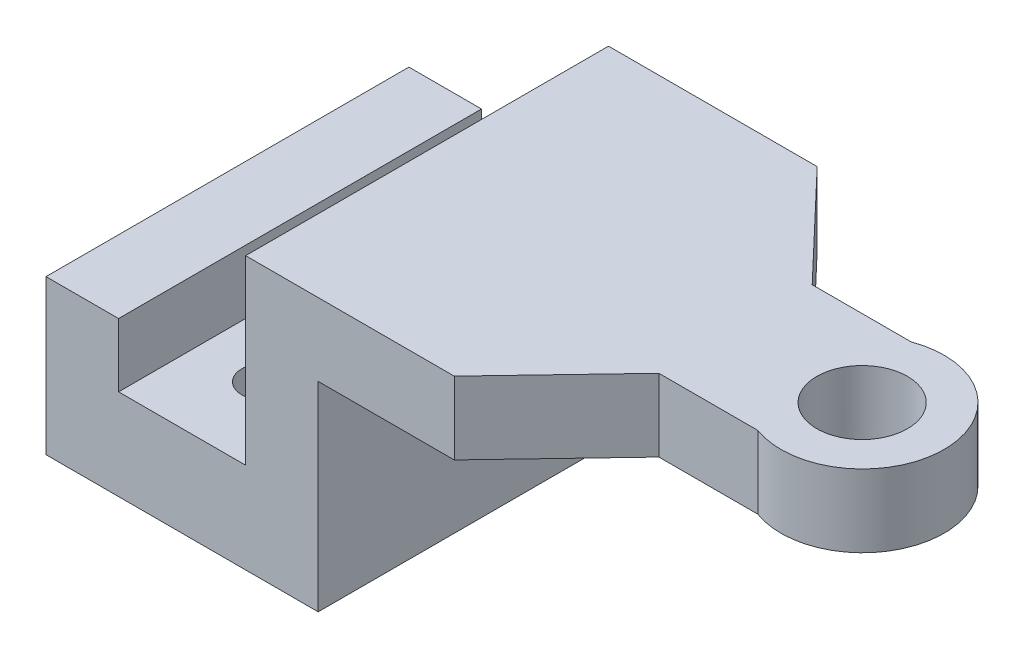
ISO-10303-21;
HEADER;
FILE_DESCRIPTION(('STEP AP214'),'2;1');
FILE_NAME('part.step','',(''),(''),'','','');
FILE_SCHEMA(('AUTOMOTIVE_DESIGN { 1 0 10303 214 1 1 1 1 }'));
ENDSEC;
DATA;
#1=APPLICATION_CONTEXT('core data for automotive mechanical design processes');
#2=APPLICATION_PROTOCOL_DEFINITION('international standard','automotive_design',2000,#1);
#3=PRODUCT_CONTEXT('',#1,'mechanical');
#4=PRODUCT('Part','Part','',(#3));
#5=PRODUCT_RELATED_PRODUCT_CATEGORY('part','',(#4));
#6=PRODUCT_DEFINITION_FORMATION('','',#4);
#7=PRODUCT_DEFINITION_CONTEXT('part definition',#1,'design');
#8=PRODUCT_DEFINITION('design','',#6,#7);
#9=PRODUCT_DEFINITION_SHAPE('','',#8);
#10=(LENGTH_UNIT() NAMED_UNIT(*) SI_UNIT(.MILLI.,.METRE.));
#11=(NAMED_UNIT(*) PLANE_ANGLE_UNIT() SI_UNIT($,.RADIAN.));
#12=(NAMED_UNIT(*) SI_UNIT($,.STERADIAN.) SOLID_ANGLE_UNIT());
#13=UNCERTAINTY_MEASURE_WITH_UNIT(LENGTH_MEASURE(1.E-05),#10,'distance_accuracy_value','');
#14=(GEOMETRIC_REPRESENTATION_CONTEXT(3) GLOBAL_UNCERTAINTY_ASSIGNED_CONTEXT((#13)) GLOBAL_UNIT_ASSIGNED_CONTEXT((#10,
#11,#12)) REPRESENTATION_CONTEXT('',''));
#15=CARTESIAN_POINT('',(0.,0.,0.));
#16=DIRECTION('',(0.,0.,1.));
#17=DIRECTION('',(1.,0.,0.));
#18=AXIS2_PLACEMENT_3D('',#15,#16,#17);
#19=CARTESIAN_POINT('',(0.,150.,0.));
#20=DIRECTION('',(-1.,0.,0.));
#21=DIRECTION('',(0.,0.,1.));
#22=AXIS2_PLACEMENT_3D('',#19,#20,#21);
#23=PLANE('',#22);
#24=DIRECTION('',(0.,-1.,0.));
#25=VECTOR('',#24,1.);
#26=CARTESIAN_POINT('',(0.,150.,0.));
#27=LINE('',#26,#25);
#28=CARTESIAN_POINT('',(0.,85.,0.));
#29=VERTEX_POINT('',#28);
#30=CARTESIAN_POINT('',(0.,0.,0.));
#31=VERTEX_POINT('',#30);
#32=EDGE_CURVE('E11',#29,#31,#27,.T.);
#33=ORIENTED_EDGE('',*,*,#32,.F.);
#34=DIRECTION('',(0.,0.,1.));
#35=VECTOR('',#34,1.);
#36=CARTESIAN_POINT('',(0.,85.,-200.));
#37=LINE('',#36,#35);
#38=CARTESIAN_POINT('',(0.,85.,-200.));
#39=VERTEX_POINT('',#38);
#40=EDGE_CURVE('E219',#39,#29,#37,.T.);
#41=ORIENTED_EDGE('',*,*,#40,.F.);
#42=DIRECTION('',(0.,-1.,0.));
#43=VECTOR('',#42,1.);
#44=CARTESIAN_POINT('',(0.,150.,-200.));
#45=LINE('',#44,#43);
#46=CARTESIAN_POINT('',(0.,0.,-200.));
#47=VERTEX_POINT('',#46);
#48=EDGE_CURVE('E150',#39,#47,#45,.T.);
#49=ORIENTED_EDGE('',*,*,#48,.T.);
#50=DIRECTION('',(0.,0.,-1.));
#51=VECTOR('',#50,1.);
#52=CARTESIAN_POINT('',(0.,0.,0.));
#53=LINE('',#52,#51);
#54=EDGE_CURVE('E151',#31,#47,#53,.T.);
#55=ORIENTED_EDGE('',*,*,#54,.F.);
#56=EDGE_LOOP('',(#33,#41,#49,#55));
#57=FACE_BOUND('',#56,.T.);
#58=ADVANCED_FACE('F47',(#57),#23,.T.);
#59=CARTESIAN_POINT('',(0.,150.,0.));
#60=DIRECTION('',(0.,0.,-1.));
#61=DIRECTION('',(-1.,0.,0.));
#62=AXIS2_PLACEMENT_3D('',#59,#60,#61);
#63=PLANE('',#62);
#64=DIRECTION('',(1.,0.,0.));
#65=VECTOR('',#64,1.);
#66=CARTESIAN_POINT('',(0.,0.,0.));
#67=LINE('',#66,#65);
#68=CARTESIAN_POINT('',(150.,0.,0.));
#69=VERTEX_POINT('',#68);
#70=EDGE_CURVE('E160',#31,#69,#67,.T.);
#71=ORIENTED_EDGE('',*,*,#70,.T.);
#72=DIRECTION('',(0.,-1.,0.));
#73=VECTOR('',#72,1.);
#74=CARTESIAN_POINT('',(150.,110.,0.));
#75=LINE('',#74,#73);
#76=CARTESIAN_POINT('',(150.,110.,0.));
#77=VERTEX_POINT('',#76);
#78=EDGE_CURVE('E64',#77,#69,#75,.T.);
#79=ORIENTED_EDGE('',*,*,#78,.F.);
#80=DIRECTION('',(-1.,0.,0.));
#81=VECTOR('',#80,1.);
#82=CARTESIAN_POINT('',(150.,110.,0.));
#83=LINE('',#82,#81);
#84=CARTESIAN_POINT('',(225.,110.,0.));
#85=VERTEX_POINT('',#84);
#86=EDGE_CURVE('E259',#85,#77,#83,.T.);
#87=ORIENTED_EDGE('',*,*,#86,.F.);
#88=DIRECTION('',(0.,-1.,0.));
#89=VECTOR('',#88,1.);
#90=CARTESIAN_POINT('',(225.,150.,0.));
#91=LINE('',#90,#89);
#92=CARTESIAN_POINT('',(225.,150.,0.));
#93=VERTEX_POINT('',#92);
#94=EDGE_CURVE('E56',#93,#85,#91,.T.);
#95=ORIENTED_EDGE('',*,*,#94,.F.);
#96=DIRECTION('',(1.,0.,0.));
#97=VECTOR('',#96,1.);
#98=CARTESIAN_POINT('',(0.,150.,0.));
#99=LINE('',#98,#97);
#100=CARTESIAN_POINT('',(110.,150.,0.));
#101=VERTEX_POINT('',#100);
#102=EDGE_CURVE('E73',#101,#93,#99,.T.);
#103=ORIENTED_EDGE('',*,*,#102,.F.);
#104=DIRECTION('',(0.,1.,0.));
#105=VECTOR('',#104,1.);
#106=CARTESIAN_POINT('',(110.,50.,0.));
#107=LINE('',#106,#105);
#108=CARTESIAN_POINT('',(110.,50.,0.));
#109=VERTEX_POINT('',#108);
#110=EDGE_CURVE('E303',#109,#101,#107,.T.);
#111=ORIENTED_EDGE('',*,*,#110,.F.);
#112=DIRECTION('',(1.,0.,0.));
#113=VECTOR('',#112,1.);
#114=CARTESIAN_POINT('',(40.,50.,0.));
#115=LINE('',#114,#113);
#116=CARTESIAN_POINT('',(40.,50.,0.));
#117=VERTEX_POINT('',#116);
#118=EDGE_CURVE('E280',#117,#109,#115,.T.);
#119=ORIENTED_EDGE('',*,*,#118,.F.);
#120=DIRECTION('',(0.,1.,0.));
#121=VECTOR('',#120,1.);
#122=CARTESIAN_POINT('',(40.,50.,0.));
#123=LINE('',#122,#121);
#124=CARTESIAN_POINT('',(40.,85.,0.));
#125=VERTEX_POINT('',#124);
#126=EDGE_CURVE('E293',#117,#125,#123,.T.);
#127=ORIENTED_EDGE('',*,*,#126,.T.);
#128=DIRECTION('',(1.,0.,0.));
#129=VECTOR('',#128,1.);
#130=CARTESIAN_POINT('',(0.,85.,0.));
#131=LINE('',#130,#129);
#132=EDGE_CURVE('E313',#29,#125,#131,.T.);
#133=ORIENTED_EDGE('',*,*,#132,.F.);
#134=ORIENTED_EDGE('',*,*,#32,.T.);
#135=EDGE_LOOP('',(#71,#79,#87,#95,#103,#111,#119,#127,#133,#134));
#136=FACE_BOUND('',#135,.T.);
#137=ADVANCED_FACE('F353',(#136),#63,.F.);
#138=CARTESIAN_POINT('',(225.,150.,0.));
#139=DIRECTION('',(-0.724158388191197,0.,-0.689633691761306));
#140=DIRECTION('',(-0.689633691761306,0.,0.724158388191197));
#141=AXIS2_PLACEMENT_3D('',#138,#139,#140);
#142=PLANE('',#141);
#143=ORIENTED_EDGE('',*,*,#94,.T.);
#144=DIRECTION('',(-0.689633691761306,0.,0.724158388191197));
#145=VECTOR('',#144,1.);
#146=CARTESIAN_POINT('',(225.,110.,0.));
#147=LINE('',#146,#145);
#148=CARTESIAN_POINT('',(280.,110.,-57.753430301229));
#149=VERTEX_POINT('',#148);
#150=EDGE_CURVE('E255',#149,#85,#147,.T.);
#151=ORIENTED_EDGE('',*,*,#150,.F.);
#152=DIRECTION('',(0.,-1.,0.));
#153=VECTOR('',#152,1.);
#154=CARTESIAN_POINT('',(280.,150.,-57.753430301229));
#155=LINE('',#154,#153);
#156=CARTESIAN_POINT('',(280.,150.,-57.753430301229));
#157=VERTEX_POINT('',#156);
#158=EDGE_CURVE('E132',#157,#149,#155,.T.);
#159=ORIENTED_EDGE('',*,*,#158,.F.);
#160=DIRECTION('',(0.689633691761306,0.,-0.724158388191197));
#161=VECTOR('',#160,1.);
#162=CARTESIAN_POINT('',(225.,150.,0.));
#163=LINE('',#162,#161);
#164=EDGE_CURVE('E116',#93,#157,#163,.T.);
#165=ORIENTED_EDGE('',*,*,#164,.F.);
#166=EDGE_LOOP('',(#143,#151,#159,#165));
#167=FACE_BOUND('',#166,.T.);
#168=ADVANCED_FACE('F359',(#167),#142,.F.);
#169=CARTESIAN_POINT('',(280.,150.,-57.753430301229));
#170=DIRECTION('',(0.,0.,-1.));
#171=DIRECTION('',(-1.,0.,0.));
#172=AXIS2_PLACEMENT_3D('',#169,#170,#171);
#173=PLANE('',#172);
#174=ORIENTED_EDGE('',*,*,#158,.T.);
#175=DIRECTION('',(-1.,0.,0.));
#176=VECTOR('',#175,1.);
#177=CARTESIAN_POINT('',(280.,110.,-57.753430301229));
#178=LINE('',#177,#176);
#179=CARTESIAN_POINT('',(334.500730704743,110.,-57.7534303012291));
#180=VERTEX_POINT('',#179);
#181=EDGE_CURVE('E128',#180,#149,#178,.T.);
#182=ORIENTED_EDGE('',*,*,#181,.F.);
#183=DIRECTION('',(0.,-1.,0.));
#184=VECTOR('',#183,1.);
#185=CARTESIAN_POINT('',(334.500730704743,150.,-57.7534303012291));
#186=LINE('',#185,#184);
#187=CARTESIAN_POINT('',(334.500730704743,150.,-57.7534303012291));
#188=VERTEX_POINT('',#187);
#189=EDGE_CURVE('E124',#188,#180,#186,.T.);
#190=ORIENTED_EDGE('',*,*,#189,.F.);
#191=DIRECTION('',(1.,0.,0.));
#192=VECTOR('',#191,1.);
#193=CARTESIAN_POINT('',(280.,150.,-57.753430301229));
#194=LINE('',#193,#192);
#195=EDGE_CURVE('E108',#157,#188,#194,.T.);
#196=ORIENTED_EDGE('',*,*,#195,.F.);
#197=EDGE_LOOP('',(#174,#182,#190,#196));
#198=FACE_BOUND('',#197,.T.);
#199=ADVANCED_FACE('F125',(#198),#173,.F.);
#200=CARTESIAN_POINT('',(350.,150.,-100.));
#201=DIRECTION('',(0.,-1.,0.));
#202=DIRECTION('',(0.,0.,-1.));
#203=AXIS2_PLACEMENT_3D('',#200,#201,#202);
#204=CYLINDRICAL_SURFACE('',#203,45.);
#205=CARTESIAN_POINT('',(350.,110.,-100.));
#206=DIRECTION('',(0.,-1.,0.));
#207=DIRECTION('',(0.,0.,1.));
#208=AXIS2_PLACEMENT_3D('',#205,#206,#207);
#209=CIRCLE('',#208,45.);
#210=CARTESIAN_POINT('',(334.500730704743,110.,-142.246569698771));
#211=VERTEX_POINT('',#210);
#212=EDGE_CURVE('E242',#211,#180,#209,.T.);
#213=ORIENTED_EDGE('',*,*,#212,.F.);
#214=DIRECTION('',(0.,-1.,0.));
#215=VECTOR('',#214,1.);
#216=CARTESIAN_POINT('',(334.500730704743,150.,-142.246569698771));
#217=LINE('',#216,#215);
#218=CARTESIAN_POINT('',(334.500730704743,150.,-142.246569698771));
#219=VERTEX_POINT('',#218);
#220=EDGE_CURVE('E133',#219,#211,#217,.T.);
#221=ORIENTED_EDGE('',*,*,#220,.F.);
#222=CARTESIAN_POINT('',(350.,150.,-100.));
#223=DIRECTION('',(0.,-1.,0.));
#224=DIRECTION('',(0.,0.,-1.));
#225=AXIS2_PLACEMENT_3D('',#222,#223,#224);
#226=CIRCLE('',#225,45.);
#227=EDGE_CURVE('E113',#219,#188,#226,.T.);
#228=ORIENTED_EDGE('',*,*,#227,.T.);
#229=ORIENTED_EDGE('',*,*,#189,.T.);
#230=EDGE_LOOP('',(#213,#221,#228,#229));
#231=FACE_BOUND('',#230,.T.);
#232=ADVANCED_FACE('F135',(#231),#204,.T.);
#233=CARTESIAN_POINT('',(280.,150.,-142.246569698771));
#234=DIRECTION('',(0.,0.,-1.));
#235=DIRECTION('',(-1.,0.,0.));
#236=AXIS2_PLACEMENT_3D('',#233,#234,#235);
#237=PLANE('',#236);
#238=DIRECTION('',(1.,0.,0.));
#239=VECTOR('',#238,1.);
#240=CARTESIAN_POINT('',(280.,110.,-142.246569698771));
#241=LINE('',#240,#239);
#242=CARTESIAN_POINT('',(280.,110.,-142.246569698771));
#243=VERTEX_POINT('',#242);
#244=EDGE_CURVE('E235',#243,#211,#241,.T.);
#245=ORIENTED_EDGE('',*,*,#244,.F.);
#246=DIRECTION('',(0.,-1.,0.));
#247=VECTOR('',#246,1.);
#248=CARTESIAN_POINT('',(280.,150.,-142.246569698771));
#249=LINE('',#248,#247);
#250=CARTESIAN_POINT('',(280.,150.,-142.246569698771));
#251=VERTEX_POINT('',#250);
#252=EDGE_CURVE('E170',#251,#243,#249,.T.);
#253=ORIENTED_EDGE('',*,*,#252,.F.);
#254=DIRECTION('',(1.,0.,0.));
#255=VECTOR('',#254,1.);
#256=CARTESIAN_POINT('',(280.,150.,-142.246569698771));
#257=LINE('',#256,#255);
#258=EDGE_CURVE('E138',#251,#219,#257,.T.);
#259=ORIENTED_EDGE('',*,*,#258,.T.);
#260=ORIENTED_EDGE('',*,*,#220,.T.);
#261=EDGE_LOOP('',(#245,#253,#259,#260));
#262=FACE_BOUND('',#261,.T.);
#263=ADVANCED_FACE('F232',(#262),#237,.T.);
#264=CARTESIAN_POINT('',(225.,150.,-200.));
#265=DIRECTION('',(0.724158388191198,0.,-0.689633691761305));
#266=DIRECTION('',(-0.689633691761305,0.,-0.724158388191198));
#267=AXIS2_PLACEMENT_3D('',#264,#265,#266);
#268=PLANE('',#267);
#269=DIRECTION('',(0.689633691761305,0.,0.724158388191198));
#270=VECTOR('',#269,1.);
#271=CARTESIAN_POINT('',(225.,110.,-200.));
#272=LINE('',#271,#270);
#273=CARTESIAN_POINT('',(225.,110.,-200.));
#274=VERTEX_POINT('',#273);
#275=EDGE_CURVE('E243',#274,#243,#272,.T.);
#276=ORIENTED_EDGE('',*,*,#275,.F.);
#277=DIRECTION('',(0.,-1.,0.));
#278=VECTOR('',#277,1.);
#279=CARTESIAN_POINT('',(225.,150.,-200.));
#280=LINE('',#279,#278);
#281=CARTESIAN_POINT('',(225.,150.,-200.));
#282=VERTEX_POINT('',#281);
#283=EDGE_CURVE('E174',#282,#274,#280,.T.);
#284=ORIENTED_EDGE('',*,*,#283,.F.);
#285=DIRECTION('',(0.689633691761305,0.,0.724158388191198));
#286=VECTOR('',#285,1.);
#287=CARTESIAN_POINT('',(225.,150.,-200.));
#288=LINE('',#287,#286);
#289=EDGE_CURVE('E142',#282,#251,#288,.T.);
#290=ORIENTED_EDGE('',*,*,#289,.T.);
#291=ORIENTED_EDGE('',*,*,#252,.T.);
#292=EDGE_LOOP('',(#276,#284,#290,#291));
#293=FACE_BOUND('',#292,.T.);
#294=ADVANCED_FACE('F227',(#293),#268,.T.);
#295=CARTESIAN_POINT('',(0.,150.,-200.));
#296=DIRECTION('',(0.,0.,-1.));
#297=DIRECTION('',(-1.,0.,0.));
#298=AXIS2_PLACEMENT_3D('',#295,#296,#297);
#299=PLANE('',#298);
#300=DIRECTION('',(0.,-1.,0.));
#301=VECTOR('',#300,1.);
#302=CARTESIAN_POINT('',(150.,110.,-200.));
#303=LINE('',#302,#301);
#304=CARTESIAN_POINT('',(150.,110.,-200.));
#305=VERTEX_POINT('',#304);
#306=CARTESIAN_POINT('',(150.,0.,-200.));
#307=VERTEX_POINT('',#306);
#308=EDGE_CURVE('E270',#305,#307,#303,.T.);
#309=ORIENTED_EDGE('',*,*,#308,.T.);
#310=DIRECTION('',(1.,0.,0.));
#311=VECTOR('',#310,1.);
#312=CARTESIAN_POINT('',(0.,0.,-200.));
#313=LINE('',#312,#311);
#314=EDGE_CURVE('E155',#47,#307,#313,.T.);
#315=ORIENTED_EDGE('',*,*,#314,.F.);
#316=ORIENTED_EDGE('',*,*,#48,.F.);
#317=DIRECTION('',(-1.,0.,0.));
#318=VECTOR('',#317,1.);
#319=CARTESIAN_POINT('',(40.,85.,-200.));
#320=LINE('',#319,#318);
#321=CARTESIAN_POINT('',(40.,85.,-200.));
#322=VERTEX_POINT('',#321);
#323=EDGE_CURVE('E320',#322,#39,#320,.T.);
#324=ORIENTED_EDGE('',*,*,#323,.F.);
#325=DIRECTION('',(0.,1.,0.));
#326=VECTOR('',#325,1.);
#327=CARTESIAN_POINT('',(40.,50.,-200.));
#328=LINE('',#327,#326);
#329=CARTESIAN_POINT('',(40.,50.,-200.));
#330=VERTEX_POINT('',#329);
#331=EDGE_CURVE('E212',#330,#322,#328,.T.);
#332=ORIENTED_EDGE('',*,*,#331,.F.);
#333=DIRECTION('',(-1.,0.,0.));
#334=VECTOR('',#333,1.);
#335=CARTESIAN_POINT('',(110.,50.,-200.));
#336=LINE('',#335,#334);
#337=CARTESIAN_POINT('',(110.,50.,-200.));
#338=VERTEX_POINT('',#337);
#339=EDGE_CURVE('E289',#338,#330,#336,.T.);
#340=ORIENTED_EDGE('',*,*,#339,.F.);
#341=DIRECTION('',(0.,1.,0.));
#342=VECTOR('',#341,1.);
#343=CARTESIAN_POINT('',(110.,50.,-200.));
#344=LINE('',#343,#342);
#345=CARTESIAN_POINT('',(110.,150.,-200.));
#346=VERTEX_POINT('',#345);
#347=EDGE_CURVE('E300',#338,#346,#344,.T.);
#348=ORIENTED_EDGE('',*,*,#347,.T.);
#349=DIRECTION('',(1.,0.,0.));
#350=VECTOR('',#349,1.);
#351=CARTESIAN_POINT('',(0.,150.,-200.));
#352=LINE('',#351,#350);
#353=EDGE_CURVE('E96',#346,#282,#352,.T.);
#354=ORIENTED_EDGE('',*,*,#353,.T.);
#355=ORIENTED_EDGE('',*,*,#283,.T.);
#356=DIRECTION('',(1.,0.,0.));
#357=VECTOR('',#356,1.);
#358=CARTESIAN_POINT('',(150.,110.,-200.));
#359=LINE('',#358,#357);
#360=EDGE_CURVE('E249',#305,#274,#359,.T.);
#361=ORIENTED_EDGE('',*,*,#360,.F.);
#362=EDGE_LOOP('',(#309,#315,#316,#324,#332,#340,#348,#354,#355,#361));
#363=FACE_BOUND('',#362,.T.);
#364=ADVANCED_FACE('F403',(#363),#299,.T.);
#365=CARTESIAN_POINT('',(350.,150.,-100.));
#366=DIRECTION('',(0.,-1.,0.));
#367=DIRECTION('',(0.,0.,-1.));
#368=AXIS2_PLACEMENT_3D('',#365,#366,#367);
#369=PLANE('',#368);
#370=CARTESIAN_POINT('',(350.,150.,-99.7877800455522));
#371=DIRECTION('',(0.,-1.,0.));
#372=DIRECTION('',(0.,0.,-1.));
#373=AXIS2_PLACEMENT_3D('',#370,#371,#372);
#374=CIRCLE('',#373,25.);
#375=CARTESIAN_POINT('',(350.,150.,-124.787780045552));
#376=VERTEX_POINT('',#375);
#377=EDGE_CURVE('E202',#376,#376,#374,.T.);
#378=ORIENTED_EDGE('',*,*,#377,.T.);
#379=EDGE_LOOP('',(#378));
#380=FACE_BOUND('',#379,.T.);
#381=ORIENTED_EDGE('',*,*,#353,.F.);
#382=DIRECTION('',(0.,0.,-1.));
#383=VECTOR('',#382,1.);
#384=CARTESIAN_POINT('',(110.,150.,0.));
#385=LINE('',#384,#383);
#386=EDGE_CURVE('E281',#101,#346,#385,.T.);
#387=ORIENTED_EDGE('',*,*,#386,.F.);
#388=ORIENTED_EDGE('',*,*,#102,.T.);
#389=ORIENTED_EDGE('',*,*,#164,.T.);
#390=ORIENTED_EDGE('',*,*,#195,.T.);
#391=ORIENTED_EDGE('',*,*,#227,.F.);
#392=ORIENTED_EDGE('',*,*,#258,.F.);
#393=ORIENTED_EDGE('',*,*,#289,.F.);
#394=EDGE_LOOP('',(#381,#387,#388,#389,#390,#391,#392,#393));
#395=FACE_BOUND('',#394,.T.);
#396=ADVANCED_FACE('F110',(#380,#395),#369,.F.);
#397=CARTESIAN_POINT('',(350.,0.,-100.));
#398=DIRECTION('',(0.,-1.,0.));
#399=DIRECTION('',(0.,0.,-1.));
#400=AXIS2_PLACEMENT_3D('',#397,#398,#399);
#401=PLANE('',#400);
#402=DIRECTION('',(0.,0.,-1.));
#403=VECTOR('',#402,1.);
#404=CARTESIAN_POINT('',(150.,0.,-200.));
#405=LINE('',#404,#403);
#406=EDGE_CURVE('E267',#69,#307,#405,.T.);
#407=ORIENTED_EDGE('',*,*,#406,.F.);
#408=ORIENTED_EDGE('',*,*,#70,.F.);
#409=ORIENTED_EDGE('',*,*,#54,.T.);
#410=ORIENTED_EDGE('',*,*,#314,.T.);
#411=EDGE_LOOP('',(#407,#408,#409,#410));
#412=FACE_BOUND('',#411,.T.);
#413=CARTESIAN_POINT('',(75.,0.,-155.));
#414=DIRECTION('',(0.,-1.,0.));
#415=DIRECTION('',(0.,0.,-1.));
#416=AXIS2_PLACEMENT_3D('',#413,#414,#415);
#417=CIRCLE('',#416,25.);
#418=CARTESIAN_POINT('',(75.,0.,-180.));
#419=VERTEX_POINT('',#418);
#420=EDGE_CURVE('E195',#419,#419,#417,.T.);
#421=ORIENTED_EDGE('',*,*,#420,.F.);
#422=EDGE_LOOP('',(#421));
#423=FACE_BOUND('',#422,.T.);
#424=CARTESIAN_POINT('',(75.4244399088947,0.,-45.));
#425=DIRECTION('',(0.,-1.,0.));
#426=DIRECTION('',(0.,0.,-1.));
#427=AXIS2_PLACEMENT_3D('',#424,#425,#426);
#428=CIRCLE('',#427,25.);
#429=CARTESIAN_POINT('',(75.4244399088947,0.,-70.));
#430=VERTEX_POINT('',#429);
#431=EDGE_CURVE('E185',#430,#430,#428,.T.);
#432=ORIENTED_EDGE('',*,*,#431,.F.);
#433=EDGE_LOOP('',(#432));
#434=FACE_BOUND('',#433,.T.);
#435=ADVANCED_FACE('F409',(#412,#423,#434),#401,.T.);
#436=CARTESIAN_POINT('',(75.4244399088947,20.,-45.));
#437=DIRECTION('',(0.,-1.,0.));
#438=DIRECTION('',(0.,0.,-1.));
#439=AXIS2_PLACEMENT_3D('',#436,#437,#438);
#440=PLANE('',#439);
#441=CARTESIAN_POINT('',(75.4244399088947,20.,-45.));
#442=DIRECTION('',(0.,-1.,0.));
#443=DIRECTION('',(0.,0.,-1.));
#444=AXIS2_PLACEMENT_3D('',#441,#442,#443);
#445=CIRCLE('',#444,25.);
#446=CARTESIAN_POINT('',(75.4244399088947,20.,-70.));
#447=VERTEX_POINT('',#446);
#448=EDGE_CURVE('E181',#447,#447,#445,.T.);
#449=ORIENTED_EDGE('',*,*,#448,.T.);
#450=EDGE_LOOP('',(#449));
#451=FACE_BOUND('',#450,.T.);
#452=CARTESIAN_POINT('',(75.4244399088947,20.,-45.));
#453=DIRECTION('',(0.,-1.,0.));
#454=DIRECTION('',(0.,0.,-1.));
#455=AXIS2_PLACEMENT_3D('',#452,#453,#454);
#456=CIRCLE('',#455,12.5);
#457=CARTESIAN_POINT('',(75.4244399088947,20.,-57.5));
#458=VERTEX_POINT('',#457);
#459=EDGE_CURVE('E156',#458,#458,#456,.F.);
#460=ORIENTED_EDGE('',*,*,#459,.T.);
#461=EDGE_LOOP('',(#460));
#462=FACE_BOUND('',#461,.T.);
#463=ADVANCED_FACE('F422',(#451,#462),#440,.T.);
#464=CARTESIAN_POINT('',(75.4244399088947,20.,-45.));
#465=DIRECTION('',(0.,-1.,0.));
#466=DIRECTION('',(0.,0.,-1.));
#467=AXIS2_PLACEMENT_3D('',#464,#465,#466);
#468=CYLINDRICAL_SURFACE('',#467,25.);
#469=ORIENTED_EDGE('',*,*,#448,.F.);
#470=EDGE_LOOP('',(#469));
#471=FACE_BOUND('',#470,.T.);
#472=ORIENTED_EDGE('',*,*,#431,.T.);
#473=EDGE_LOOP('',(#472));
#474=FACE_BOUND('',#473,.T.);
#475=ADVANCED_FACE('F429',(#471,#474),#468,.F.);
#476=CARTESIAN_POINT('',(75.4244399088947,50.,-45.));
#477=DIRECTION('',(0.,-1.,0.));
#478=DIRECTION('',(0.,0.,-1.));
#479=AXIS2_PLACEMENT_3D('',#476,#477,#478);
#480=CYLINDRICAL_SURFACE('',#479,12.5);
#481=CARTESIAN_POINT('',(75.4244399088947,50.,-45.));
#482=DIRECTION('',(0.,-1.,0.));
#483=DIRECTION('',(0.,0.,-1.));
#484=AXIS2_PLACEMENT_3D('',#481,#482,#483);
#485=CIRCLE('',#484,12.5);
#486=CARTESIAN_POINT('',(75.4244399088947,50.,-57.5));
#487=VERTEX_POINT('',#486);
#488=EDGE_CURVE('E211',#487,#487,#485,.T.);
#489=ORIENTED_EDGE('',*,*,#488,.F.);
#490=EDGE_LOOP('',(#489));
#491=FACE_BOUND('',#490,.T.);
#492=ORIENTED_EDGE('',*,*,#459,.F.);
#493=EDGE_LOOP('',(#492));
#494=FACE_BOUND('',#493,.T.);
#495=ADVANCED_FACE('F425',(#491,#494),#480,.F.);
#496=CARTESIAN_POINT('',(75.,20.,-155.));
#497=DIRECTION('',(0.,-1.,0.));
#498=DIRECTION('',(0.,0.,-1.));
#499=AXIS2_PLACEMENT_3D('',#496,#497,#498);
#500=PLANE('',#499);
#501=CARTESIAN_POINT('',(75.,20.,-155.));
#502=DIRECTION('',(0.,-1.,0.));
#503=DIRECTION('',(0.,0.,-1.));
#504=AXIS2_PLACEMENT_3D('',#501,#502,#503);
#505=CIRCLE('',#504,25.);
#506=CARTESIAN_POINT('',(75.,20.,-180.));
#507=VERTEX_POINT('',#506);
#508=EDGE_CURVE('E186',#507,#507,#505,.T.);
#509=ORIENTED_EDGE('',*,*,#508,.T.);
#510=EDGE_LOOP('',(#509));
#511=FACE_BOUND('',#510,.T.);
#512=CARTESIAN_POINT('',(75.,20.,-155.));
#513=DIRECTION('',(0.,-1.,0.));
#514=DIRECTION('',(0.,0.,-1.));
#515=AXIS2_PLACEMENT_3D('',#512,#513,#514);
#516=CIRCLE('',#515,12.5);
#517=CARTESIAN_POINT('',(75.,20.,-167.5));
#518=VERTEX_POINT('',#517);
#519=EDGE_CURVE('E182',#518,#518,#516,.F.);
#520=ORIENTED_EDGE('',*,*,#519,.T.);
#521=EDGE_LOOP('',(#520));
#522=FACE_BOUND('',#521,.T.);
#523=ADVANCED_FACE('F428',(#511,#522),#500,.T.);
#524=CARTESIAN_POINT('',(75.,20.,-155.));
#525=DIRECTION('',(0.,-1.,0.));
#526=DIRECTION('',(0.,0.,-1.));
#527=AXIS2_PLACEMENT_3D('',#524,#525,#526);
#528=CYLINDRICAL_SURFACE('',#527,25.);
#529=ORIENTED_EDGE('',*,*,#508,.F.);
#530=EDGE_LOOP('',(#529));
#531=FACE_BOUND('',#530,.T.);
#532=ORIENTED_EDGE('',*,*,#420,.T.);
#533=EDGE_LOOP('',(#532));
#534=FACE_BOUND('',#533,.T.);
#535=ADVANCED_FACE('F347',(#531,#534),#528,.F.);
#536=CARTESIAN_POINT('',(75.,50.,-155.));
#537=DIRECTION('',(0.,-1.,0.));
#538=DIRECTION('',(0.,0.,-1.));
#539=AXIS2_PLACEMENT_3D('',#536,#537,#538);
#540=CYLINDRICAL_SURFACE('',#539,12.5);
#541=CARTESIAN_POINT('',(75.,50.,-155.));
#542=DIRECTION('',(0.,-1.,0.));
#543=DIRECTION('',(0.,0.,-1.));
#544=AXIS2_PLACEMENT_3D('',#541,#542,#543);
#545=CIRCLE('',#544,12.5);
#546=CARTESIAN_POINT('',(75.,50.,-167.5));
#547=VERTEX_POINT('',#546);
#548=EDGE_CURVE('E207',#547,#547,#545,.T.);
#549=ORIENTED_EDGE('',*,*,#548,.F.);
#550=EDGE_LOOP('',(#549));
#551=FACE_BOUND('',#550,.T.);
#552=ORIENTED_EDGE('',*,*,#519,.F.);
#553=EDGE_LOOP('',(#552));
#554=FACE_BOUND('',#553,.T.);
#555=ADVANCED_FACE('F336',(#551,#554),#540,.F.);
#556=CARTESIAN_POINT('',(350.,150.,-99.7877800455522));
#557=DIRECTION('',(0.,-1.,0.));
#558=DIRECTION('',(0.,0.,-1.));
#559=AXIS2_PLACEMENT_3D('',#556,#557,#558);
#560=CYLINDRICAL_SURFACE('',#559,25.);
#561=CARTESIAN_POINT('',(350.,110.,-99.7877800455522));
#562=DIRECTION('',(0.,1.,0.));
#563=DIRECTION('',(0.,0.,1.));
#564=AXIS2_PLACEMENT_3D('',#561,#562,#563);
#565=CIRCLE('',#564,25.);
#566=CARTESIAN_POINT('',(350.,110.,-74.7877800455522));
#567=VERTEX_POINT('',#566);
#568=EDGE_CURVE('E50',#567,#567,#565,.F.);
#569=ORIENTED_EDGE('',*,*,#568,.T.);
#570=EDGE_LOOP('',(#569));
#571=FACE_BOUND('',#570,.T.);
#572=ORIENTED_EDGE('',*,*,#377,.F.);
#573=EDGE_LOOP('',(#572));
#574=FACE_BOUND('',#573,.T.);
#575=ADVANCED_FACE('F333',(#571,#574),#560,.F.);
#576=CARTESIAN_POINT('',(0.,85.,0.));
#577=DIRECTION('',(0.,1.,0.));
#578=DIRECTION('',(0.,0.,1.));
#579=AXIS2_PLACEMENT_3D('',#576,#577,#578);
#580=PLANE('',#579);
#581=ORIENTED_EDGE('',*,*,#40,.T.);
#582=ORIENTED_EDGE('',*,*,#132,.T.);
#583=DIRECTION('',(0.,0.,-1.));
#584=VECTOR('',#583,1.);
#585=CARTESIAN_POINT('',(40.,85.,0.));
#586=LINE('',#585,#584);
#587=EDGE_CURVE('E317',#125,#322,#586,.T.);
#588=ORIENTED_EDGE('',*,*,#587,.T.);
#589=ORIENTED_EDGE('',*,*,#323,.T.);
#590=EDGE_LOOP('',(#581,#582,#588,#589));
#591=FACE_BOUND('',#590,.T.);
#592=ADVANCED_FACE('F335',(#591),#580,.T.);
#593=CARTESIAN_POINT('',(0.,50.,0.));
#594=DIRECTION('',(0.,1.,0.));
#595=DIRECTION('',(0.,0.,1.));
#596=AXIS2_PLACEMENT_3D('',#593,#594,#595);
#597=PLANE('',#596);
#598=DIRECTION('',(0.,0.,1.));
#599=VECTOR('',#598,1.);
#600=CARTESIAN_POINT('',(40.,50.,-200.));
#601=LINE('',#600,#599);
#602=EDGE_CURVE('E276',#330,#117,#601,.T.);
#603=ORIENTED_EDGE('',*,*,#602,.T.);
#604=ORIENTED_EDGE('',*,*,#118,.T.);
#605=DIRECTION('',(0.,0.,-1.));
#606=VECTOR('',#605,1.);
#607=CARTESIAN_POINT('',(110.,50.,0.));
#608=LINE('',#607,#606);
#609=EDGE_CURVE('E285',#109,#338,#608,.T.);
#610=ORIENTED_EDGE('',*,*,#609,.T.);
#611=ORIENTED_EDGE('',*,*,#339,.T.);
#612=EDGE_LOOP('',(#603,#604,#610,#611));
#613=FACE_BOUND('',#612,.T.);
#614=ORIENTED_EDGE('',*,*,#548,.T.);
#615=EDGE_LOOP('',(#614));
#616=FACE_BOUND('',#615,.T.);
#617=ORIENTED_EDGE('',*,*,#488,.T.);
#618=EDGE_LOOP('',(#617));
#619=FACE_BOUND('',#618,.T.);
#620=ADVANCED_FACE('F344',(#613,#616,#619),#597,.T.);
#621=CARTESIAN_POINT('',(40.,50.,-200.));
#622=DIRECTION('',(-1.,0.,0.));
#623=DIRECTION('',(0.,0.,1.));
#624=AXIS2_PLACEMENT_3D('',#621,#622,#623);
#625=PLANE('',#624);
#626=ORIENTED_EDGE('',*,*,#587,.F.);
#627=ORIENTED_EDGE('',*,*,#126,.F.);
#628=ORIENTED_EDGE('',*,*,#602,.F.);
#629=ORIENTED_EDGE('',*,*,#331,.T.);
#630=EDGE_LOOP('',(#626,#627,#628,#629));
#631=FACE_BOUND('',#630,.T.);
#632=ADVANCED_FACE('F482',(#631),#625,.F.);
#633=CARTESIAN_POINT('',(110.,50.,0.));
#634=DIRECTION('',(1.,0.,0.));
#635=DIRECTION('',(0.,0.,-1.));
#636=AXIS2_PLACEMENT_3D('',#633,#634,#635);
#637=PLANE('',#636);
#638=ORIENTED_EDGE('',*,*,#386,.T.);
#639=ORIENTED_EDGE('',*,*,#347,.F.);
#640=ORIENTED_EDGE('',*,*,#609,.F.);
#641=ORIENTED_EDGE('',*,*,#110,.T.);
#642=EDGE_LOOP('',(#638,#639,#640,#641));
#643=FACE_BOUND('',#642,.T.);
#644=ADVANCED_FACE('F491',(#643),#637,.F.);
#645=CARTESIAN_POINT('',(350.,110.,-100.));
#646=DIRECTION('',(0.,1.,0.));
#647=DIRECTION('',(0.,0.,1.));
#648=AXIS2_PLACEMENT_3D('',#645,#646,#647);
#649=PLANE('',#648);
#650=ORIENTED_EDGE('',*,*,#360,.T.);
#651=ORIENTED_EDGE('',*,*,#275,.T.);
#652=ORIENTED_EDGE('',*,*,#244,.T.);
#653=ORIENTED_EDGE('',*,*,#212,.T.);
#654=ORIENTED_EDGE('',*,*,#181,.T.);
#655=ORIENTED_EDGE('',*,*,#150,.T.);
#656=ORIENTED_EDGE('',*,*,#86,.T.);
#657=DIRECTION('',(0.,0.,-1.));
#658=VECTOR('',#657,1.);
#659=CARTESIAN_POINT('',(150.,110.,-200.));
#660=LINE('',#659,#658);
#661=EDGE_CURVE('E263',#77,#305,#660,.T.);
#662=ORIENTED_EDGE('',*,*,#661,.T.);
#663=EDGE_LOOP('',(#650,#651,#652,#653,#654,#655,#656,#662));
#664=FACE_BOUND('',#663,.T.);
#665=ORIENTED_EDGE('',*,*,#568,.F.);
#666=EDGE_LOOP('',(#665));
#667=FACE_BOUND('',#666,.T.);
#668=ADVANCED_FACE('F400',(#664,#667),#649,.F.);
#669=CARTESIAN_POINT('',(150.,110.,-200.));
#670=DIRECTION('',(-1.,0.,0.));
#671=DIRECTION('',(0.,0.,1.));
#672=AXIS2_PLACEMENT_3D('',#669,#670,#671);
#673=PLANE('',#672);
#674=ORIENTED_EDGE('',*,*,#406,.T.);
#675=ORIENTED_EDGE('',*,*,#308,.F.);
#676=ORIENTED_EDGE('',*,*,#661,.F.);
#677=ORIENTED_EDGE('',*,*,#78,.T.);
#678=EDGE_LOOP('',(#674,#675,#676,#677));
#679=FACE_BOUND('',#678,.T.);
#680=ADVANCED_FACE('F507',(#679),#673,.F.);
#681=CLOSED_SHELL('',(#58,#137,#168,#199,#232,#263,#294,#364,#396,#435,#463,#475,#495,#523,#535,
#555,#575,#592,#620,#632,#644,#668,#680));
#682=MANIFOLD_SOLID_BREP('B2',#681);
#683=ADVANCED_BREP_SHAPE_REPRESENTATION('',(#18,#682),#14);
#684=SHAPE_DEFINITION_REPRESENTATION(#9,#683);
ENDSEC;
END-ISO-10303-21;
